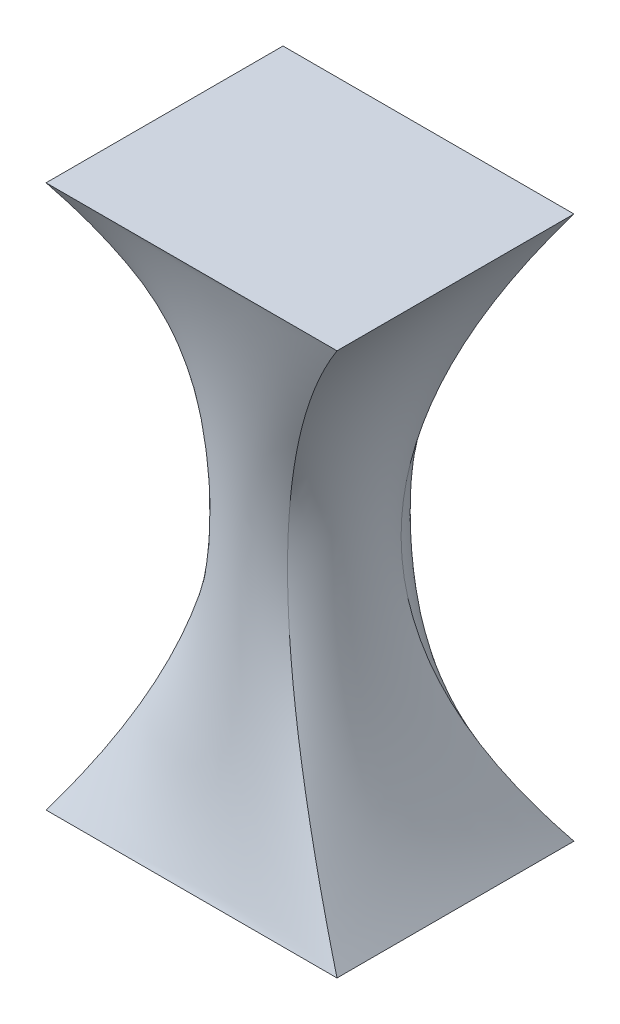
ISO-10303-21;
HEADER;
FILE_DESCRIPTION(('STEP AP214'),'2;1');
FILE_NAME('part.step','',(''),(''),'','','');
FILE_SCHEMA(('AUTOMOTIVE_DESIGN { 1 0 10303 214 1 1 1 1 }'));
ENDSEC;
DATA;
#1=APPLICATION_CONTEXT('core data for automotive mechanical design processes');
#2=APPLICATION_PROTOCOL_DEFINITION('international standard','automotive_design',2000,#1);
#3=PRODUCT_CONTEXT('',#1,'mechanical');
#4=PRODUCT('Part','Part','',(#3));
#5=PRODUCT_RELATED_PRODUCT_CATEGORY('part','',(#4));
#6=PRODUCT_DEFINITION_FORMATION('','',#4);
#7=PRODUCT_DEFINITION_CONTEXT('part definition',#1,'design');
#8=PRODUCT_DEFINITION('design','',#6,#7);
#9=PRODUCT_DEFINITION_SHAPE('','',#8);
#10=(LENGTH_UNIT() NAMED_UNIT(*) SI_UNIT(.MILLI.,.METRE.));
#11=(NAMED_UNIT(*) PLANE_ANGLE_UNIT() SI_UNIT($,.RADIAN.));
#12=(NAMED_UNIT(*) SI_UNIT($,.STERADIAN.) SOLID_ANGLE_UNIT());
#13=UNCERTAINTY_MEASURE_WITH_UNIT(LENGTH_MEASURE(1.E-05),#10,'distance_accuracy_value','');
#14=(GEOMETRIC_REPRESENTATION_CONTEXT(3) GLOBAL_UNCERTAINTY_ASSIGNED_CONTEXT((#13)) GLOBAL_UNIT_ASSIGNED_CONTEXT((#10,
#11,#12)) REPRESENTATION_CONTEXT('',''));
#15=CARTESIAN_POINT('',(0.,0.,0.));
#16=DIRECTION('',(0.,0.,1.));
#17=DIRECTION('',(1.,0.,0.));
#18=AXIS2_PLACEMENT_3D('',#15,#16,#17);
#19=CARTESIAN_POINT('',(0.,0.,0.));
#20=DIRECTION('',(0.,-1.,0.));
#21=DIRECTION('',(0.,0.,-1.));
#22=AXIS2_PLACEMENT_3D('',#19,#20,#21);
#23=PLANE('',#22);
#24=DIRECTION('',(0.,0.,-1.));
#25=VECTOR('',#24,1.);
#26=CARTESIAN_POINT('',(26.7804613137385,0.,21.809610025805));
#27=LINE('',#26,#25);
#28=CARTESIAN_POINT('',(26.7804613137385,0.,21.809610025805));
#29=VERTEX_POINT('',#28);
#30=CARTESIAN_POINT('',(26.7804613137385,0.,-21.809610025805));
#31=VERTEX_POINT('',#30);
#32=EDGE_CURVE('E212',#29,#31,#27,.T.);
#33=ORIENTED_EDGE('',*,*,#32,.F.);
#34=DIRECTION('',(1.,0.,0.));
#35=VECTOR('',#34,1.);
#36=CARTESIAN_POINT('',(-26.7804613137385,0.,21.809610025805));
#37=LINE('',#36,#35);
#38=CARTESIAN_POINT('',(-26.7804613137385,0.,21.809610025805));
#39=VERTEX_POINT('',#38);
#40=EDGE_CURVE('E12',#39,#29,#37,.T.);
#41=ORIENTED_EDGE('',*,*,#40,.F.);
#42=DIRECTION('',(0.,0.,1.));
#43=VECTOR('',#42,1.);
#44=CARTESIAN_POINT('',(-26.7804613137385,0.,21.809610025805));
#45=LINE('',#44,#43);
#46=CARTESIAN_POINT('',(-26.7804613137385,0.,-21.809610025805));
#47=VERTEX_POINT('',#46);
#48=EDGE_CURVE('E98',#47,#39,#45,.T.);
#49=ORIENTED_EDGE('',*,*,#48,.F.);
#50=DIRECTION('',(-1.,0.,0.));
#51=VECTOR('',#50,1.);
#52=CARTESIAN_POINT('',(-26.7804613137385,0.,-21.809610025805));
#53=LINE('',#52,#51);
#54=EDGE_CURVE('E232',#31,#47,#53,.T.);
#55=ORIENTED_EDGE('',*,*,#54,.F.);
#56=EDGE_LOOP('',(#33,#41,#49,#55));
#57=FACE_BOUND('',#56,.T.);
#58=ADVANCED_FACE('F87',(#57),#23,.T.);
#59=CARTESIAN_POINT('',(0.,100.,0.));
#60=DIRECTION('',(0.,-1.,0.));
#61=DIRECTION('',(0.,0.,-1.));
#62=AXIS2_PLACEMENT_3D('',#59,#60,#61);
#63=PLANE('',#62);
#64=DIRECTION('',(0.,0.,-1.));
#65=VECTOR('',#64,1.);
#66=CARTESIAN_POINT('',(26.7804613137385,100.,21.809610025805));
#67=LINE('',#66,#65);
#68=CARTESIAN_POINT('',(26.7804613137385,100.,21.809610025805));
#69=VERTEX_POINT('',#68);
#70=CARTESIAN_POINT('',(26.7804613137385,100.,-21.809610025805));
#71=VERTEX_POINT('',#70);
#72=EDGE_CURVE('E200',#69,#71,#67,.T.);
#73=ORIENTED_EDGE('',*,*,#72,.T.);
#74=DIRECTION('',(-1.,0.,0.));
#75=VECTOR('',#74,1.);
#76=CARTESIAN_POINT('',(-26.7804613137385,100.,-21.809610025805));
#77=LINE('',#76,#75);
#78=CARTESIAN_POINT('',(-26.7804613137385,100.,-21.809610025805));
#79=VERTEX_POINT('',#78);
#80=EDGE_CURVE('E157',#71,#79,#77,.T.);
#81=ORIENTED_EDGE('',*,*,#80,.T.);
#82=DIRECTION('',(0.,0.,1.));
#83=VECTOR('',#82,1.);
#84=CARTESIAN_POINT('',(-26.7804613137385,100.,21.809610025805));
#85=LINE('',#84,#83);
#86=CARTESIAN_POINT('',(-26.7804613137385,100.,21.809610025805));
#87=VERTEX_POINT('',#86);
#88=EDGE_CURVE('E137',#79,#87,#85,.T.);
#89=ORIENTED_EDGE('',*,*,#88,.T.);
#90=DIRECTION('',(1.,0.,0.));
#91=VECTOR('',#90,1.);
#92=CARTESIAN_POINT('',(-26.7804613137385,100.,21.809610025805));
#93=LINE('',#92,#91);
#94=EDGE_CURVE('E144',#87,#69,#93,.T.);
#95=ORIENTED_EDGE('',*,*,#94,.T.);
#96=EDGE_LOOP('',(#73,#81,#89,#95));
#97=FACE_BOUND('',#96,.T.);
#98=ADVANCED_FACE('F156',(#97),#63,.F.);
#99=CARTESIAN_POINT('',(-26.7804613137385,100.,21.809610025805));
#100=CARTESIAN_POINT('',(-17.079497013062,83.3333333333333,10.2966956184417));
#101=CARTESIAN_POINT('',(-7.37853271238553,50.,-1.21621878892166));
#102=CARTESIAN_POINT('',(-17.079497013062,16.6666666666667,10.2966956184417));
#103=CARTESIAN_POINT('',(-26.7804613137385,0.,21.809610025805));
#104=CARTESIAN_POINT('',(-26.7804613137385,100.,7.26987000860168));
#105=CARTESIAN_POINT('',(-15.9002436816864,83.3333333333333,1.9842028533754));
#106=CARTESIAN_POINT('',(-12.8624661567414,50.,-4.49827068692206));
#107=CARTESIAN_POINT('',(-15.9002436816864,16.6666666666667,1.9842028533754));
#108=CARTESIAN_POINT('',(-26.7804613137385,0.,7.26987000860168));
#109=CARTESIAN_POINT('',(-26.7804613137385,100.,-7.26987000860168));
#110=CARTESIAN_POINT('',(-14.7209903503107,83.3333333333333,-6.32828991169089));
#111=CARTESIAN_POINT('',(-9.60649783463142,50.,-9.22122239361184));
#112=CARTESIAN_POINT('',(-14.7209903503107,16.6666666666667,-6.32828991169089));
#113=CARTESIAN_POINT('',(-26.7804613137385,0.,-7.26987000860168));
#114=CARTESIAN_POINT('',(-26.7804613137385,100.,-21.809610025805));
#115=CARTESIAN_POINT('',(-13.5417370189351,83.3333333333333,-14.6407826767572));
#116=CARTESIAN_POINT('',(-0.303012724131704,50.,-7.47195532770933));
#117=CARTESIAN_POINT('',(-13.5417370189351,16.6666666666667,-14.6407826767572));
#118=CARTESIAN_POINT('',(-26.7804613137385,0.,-21.809610025805));
#119=B_SPLINE_SURFACE_WITH_KNOTS('',3,3,((#99,#100,#101,#102,#103),(#104,#105,#106,#107,#108),
(#109,#110,#111,#112,#113),(#114,#115,#116,#117,#118)),.UNSPECIFIED.,.F.,.F.,.F.,(4,4),(4,1,4),
(0.,1.),(0.,0.5,1.),.UNSPECIFIED.);
#120=CARTESIAN_POINT('',(-26.7804613137385,100.,-21.809610025805));
#121=CARTESIAN_POINT('',(-13.5417370189351,83.3333333333333,-14.6407826767572));
#122=CARTESIAN_POINT('',(-0.303012724131704,50.,-7.47195532770933));
#123=CARTESIAN_POINT('',(-13.5417370189351,16.6666666666667,-14.6407826767572));
#124=CARTESIAN_POINT('',(-26.7804613137385,0.,-21.809610025805));
#125=B_SPLINE_CURVE_WITH_KNOTS('',3,(#120,#121,#122,#123,#124),.UNSPECIFIED.,.F.,.F.,(4,1,4),
(0.,0.5,1.),.UNSPECIFIED.);
#126=EDGE_CURVE('E143',#79,#47,#125,.T.);
#127=CARTESIAN_POINT('',(-26.7804613137385,100.,21.809610025805));
#128=CARTESIAN_POINT('',(-17.079497013062,83.3333333333333,10.2966956184417));
#129=CARTESIAN_POINT('',(-7.37853271238553,50.,-1.21621878892166));
#130=CARTESIAN_POINT('',(-17.079497013062,16.6666666666667,10.2966956184417));
#131=CARTESIAN_POINT('',(-26.7804613137385,0.,21.809610025805));
#132=B_SPLINE_CURVE_WITH_KNOTS('',3,(#127,#128,#129,#130,#131),.UNSPECIFIED.,.F.,.F.,(4,1,4),
(0.,0.5,1.),.UNSPECIFIED.);
#133=EDGE_CURVE('E132',#39,#87,#132,.F.);
#134=ORIENTED_EDGE('',*,*,#88,.F.);
#135=ORIENTED_EDGE('',*,*,#126,.T.);
#136=ORIENTED_EDGE('',*,*,#48,.T.);
#137=ORIENTED_EDGE('',*,*,#133,.T.);
#138=EDGE_LOOP('',(#134,#135,#136,#137));
#139=FACE_BOUND('',#138,.T.);
#140=ADVANCED_FACE('F134',(#139),#119,.T.);
#141=CARTESIAN_POINT('',(-26.7804613137385,100.,-21.809610025805));
#142=CARTESIAN_POINT('',(-13.5417370189351,83.3333333333333,-14.6407826767572));
#143=CARTESIAN_POINT('',(-0.303012724131706,50.,-7.47195532770932));
#144=CARTESIAN_POINT('',(-13.5417370189351,16.6666666666667,-14.6407826767572));
#145=CARTESIAN_POINT('',(-26.7804613137385,0.,-21.809610025805));
#146=CARTESIAN_POINT('',(-24.5487562042603,100.,-21.809610025805));
#147=CARTESIAN_POINT('',(-12.2257053993901,83.3333333333333,-14.9491731373812));
#148=CARTESIAN_POINT('',(0.0433291222306049,50.,-8.20437422368112));
#149=CARTESIAN_POINT('',(-12.2257053993901,16.6666666666667,-14.9491731373812));
#150=CARTESIAN_POINT('',(-24.5487562042603,0.,-21.809610025805));
#151=CARTESIAN_POINT('',(-20.0853459853039,100.,-21.8096100258051));
#152=CARTESIAN_POINT('',(-9.59364216030018,83.3333333333333,-15.5659540586292));
#153=CARTESIAN_POINT('',(0.923109845297939,50.0000000000001,-9.26861951399294));
#154=CARTESIAN_POINT('',(-9.59364216030017,16.6666666666667,-15.5659540586293));
#155=CARTESIAN_POINT('',(-20.0853459853039,0.,-21.8096100258051));
#156=CARTESIAN_POINT('',(-13.3902306568693,100.,-21.8096100258051));
#157=CARTESIAN_POINT('',(-5.471435703682,83.3333333333333,-15.972303356156));
#158=CARTESIAN_POINT('',(2.44071504229896,49.9999999999999,-10.149414745533));
#159=CARTESIAN_POINT('',(-5.471435703682,16.6666666666666,-15.972303356156));
#160=CARTESIAN_POINT('',(-13.3902306568692,0.,-21.8096100258051));
#161=CARTESIAN_POINT('',(-6.69511532843463,100.,-21.809610025805));
#162=CARTESIAN_POINT('',(-1.32252430956442,83.3333333333334,-15.9922761387048));
#163=CARTESIAN_POINT('',(4.05159535753651,50.,-10.1709485929607));
#164=CARTESIAN_POINT('',(-1.32252430956441,16.6666666666667,-15.9922761387048));
#165=CARTESIAN_POINT('',(-6.69511532843463,0.,-21.809610025805));
#166=CARTESIAN_POINT('',(0.,100.,-21.809610025805));
#167=CARTESIAN_POINT('',(2.82471917331589,83.3333333333333,-15.5719285772251));
#168=CARTESIAN_POINT('',(5.64996796091515,49.9999999999999,-9.33580370419463));
#169=CARTESIAN_POINT('',(2.82471917331589,16.6666666666666,-15.5719285772251));
#170=CARTESIAN_POINT('',(0.,0.,-21.809610025805));
#171=CARTESIAN_POINT('',(6.69511532843462,100.,-21.809610025805));
#172=CARTESIAN_POINT('',(6.83083486808161,83.3333333333333,-14.7367960085645));
#173=CARTESIAN_POINT('',(6.96290730236437,50.0000000000001,-7.66174934776997));
#174=CARTESIAN_POINT('',(6.8308348680816,16.6666666666667,-14.7367960085646));
#175=CARTESIAN_POINT('',(6.69511532843462,0.,-21.809610025805));
#176=CARTESIAN_POINT('',(13.3902306568692,100.,-21.8096100258051));
#177=CARTESIAN_POINT('',(10.5697284493082,83.3333333333333,-13.5516961138163));
#178=CARTESIAN_POINT('',(7.76328504892058,49.9999999999998,-5.30115620049425));
#179=CARTESIAN_POINT('',(10.5697284493081,16.6666666666666,-13.5516961138162));
#180=CARTESIAN_POINT('',(13.3902306568692,0.,-21.8096100258051));
#181=CARTESIAN_POINT('',(20.0853459853039,100.,-21.8096100258051));
#182=CARTESIAN_POINT('',(14.0518141053136,83.3333333333333,-12.0766830345507));
#183=CARTESIAN_POINT('',(7.96569410199353,50.0000000000001,-2.31649269218328));
#184=CARTESIAN_POINT('',(14.0518141053137,16.6666666666667,-12.0766830345507));
#185=CARTESIAN_POINT('',(20.0853459853039,0.,-21.8096100258051));
#186=CARTESIAN_POINT('',(24.5487562042603,100.,-21.809610025805));
#187=CARTESIAN_POINT('',(16.0702693771459,83.3333333333333,-10.8900247571447));
#188=CARTESIAN_POINT('',(7.70511563301896,50.,-0.029137975303465));
#189=CARTESIAN_POINT('',(16.0702693771459,16.6666666666667,-10.8900247571447));
#190=CARTESIAN_POINT('',(24.5487562042603,0.,-21.809610025805));
#191=CARTESIAN_POINT('',(26.7804613137385,100.,-21.809610025805));
#192=CARTESIAN_POINT('',(17.079497013062,83.3333333333333,-10.2966956184417));
#193=CARTESIAN_POINT('',(7.37853271238553,50.,1.21621878892167));
#194=CARTESIAN_POINT('',(17.079497013062,16.6666666666667,-10.2966956184417));
#195=CARTESIAN_POINT('',(26.7804613137385,0.,-21.809610025805));
#196=B_SPLINE_SURFACE_WITH_KNOTS('',3,3,((#141,#142,#143,#144,#145),(#146,#147,#148,#149,#150),
(#151,#152,#153,#154,#155),(#156,#157,#158,#159,#160),(#161,#162,#163,#164,#165),(#166,#167,
#168,#169,#170),(#171,#172,#173,#174,#175),(#176,#177,#178,#179,#180),(#181,#182,#183,#184,
#185),(#186,#187,#188,#189,#190),(#191,#192,#193,#194,#195)),.UNSPECIFIED.,.F.,.F.,.F.,(4,1,1,1,
1,1,1,1,4),(4,1,4),(0.,0.125,0.25,0.375,0.5,0.625,0.75,0.875,1.),(0.,0.5,1.),.UNSPECIFIED.);
#197=CARTESIAN_POINT('',(26.7804613137385,100.,-21.809610025805));
#198=CARTESIAN_POINT('',(17.079497013062,83.3333333333333,-10.2966956184417));
#199=CARTESIAN_POINT('',(7.37853271238553,50.,1.21621878892167));
#200=CARTESIAN_POINT('',(17.079497013062,16.6666666666667,-10.2966956184417));
#201=CARTESIAN_POINT('',(26.7804613137385,0.,-21.809610025805));
#202=B_SPLINE_CURVE_WITH_KNOTS('',3,(#197,#198,#199,#200,#201),.UNSPECIFIED.,.F.,.F.,(4,1,4),
(0.,0.5,1.),.UNSPECIFIED.);
#203=EDGE_CURVE('E242',#71,#31,#202,.T.);
#204=ORIENTED_EDGE('',*,*,#80,.F.);
#205=ORIENTED_EDGE('',*,*,#203,.T.);
#206=ORIENTED_EDGE('',*,*,#54,.T.);
#207=ORIENTED_EDGE('',*,*,#126,.F.);
#208=EDGE_LOOP('',(#204,#205,#206,#207));
#209=FACE_BOUND('',#208,.T.);
#210=ADVANCED_FACE('F286',(#209),#196,.T.);
#211=CARTESIAN_POINT('',(26.7804613137385,100.,21.809610025805));
#212=CARTESIAN_POINT('',(13.5417370189351,83.3333333333333,14.6407826767572));
#213=CARTESIAN_POINT('',(0.3030127241317,50.,7.47195532770931));
#214=CARTESIAN_POINT('',(13.5417370189351,16.6666666666667,14.6407826767572));
#215=CARTESIAN_POINT('',(26.7804613137385,0.,21.809610025805));
#216=CARTESIAN_POINT('',(24.5487562042603,100.,21.809610025805));
#217=CARTESIAN_POINT('',(12.2257053993901,83.3333333333333,14.9491731373812));
#218=CARTESIAN_POINT('',(-0.0433291222306153,50.,8.20437422368113));
#219=CARTESIAN_POINT('',(12.2257053993901,16.6666666666667,14.9491731373812));
#220=CARTESIAN_POINT('',(24.5487562042603,0.,21.809610025805));
#221=CARTESIAN_POINT('',(20.0853459853039,100.,21.8096100258051));
#222=CARTESIAN_POINT('',(9.59364216030018,83.3333333333333,15.5659540586292));
#223=CARTESIAN_POINT('',(-0.923109845297938,50.0000000000001,9.2686195139929));
#224=CARTESIAN_POINT('',(9.59364216030017,16.6666666666667,15.5659540586292));
#225=CARTESIAN_POINT('',(20.0853459853039,0.,21.8096100258051));
#226=CARTESIAN_POINT('',(13.3902306568692,100.,21.8096100258051));
#227=CARTESIAN_POINT('',(5.47143570368199,83.3333333333333,15.972303356156));
#228=CARTESIAN_POINT('',(-2.44071504229896,49.9999999999999,10.149414745533));
#229=CARTESIAN_POINT('',(5.471435703682,16.6666666666667,15.972303356156));
#230=CARTESIAN_POINT('',(13.3902306568692,0.,21.8096100258051));
#231=CARTESIAN_POINT('',(6.69511532843462,100.,21.809610025805));
#232=CARTESIAN_POINT('',(1.32252430956443,83.3333333333334,15.9922761387048));
#233=CARTESIAN_POINT('',(-4.05159535753651,50.,10.1709485929607));
#234=CARTESIAN_POINT('',(1.32252430956441,16.6666666666667,15.9922761387048));
#235=CARTESIAN_POINT('',(6.69511532843463,0.,21.809610025805));
#236=CARTESIAN_POINT('',(0.,100.,21.809610025805));
#237=CARTESIAN_POINT('',(-2.8247191733159,83.3333333333333,15.5719285772251));
#238=CARTESIAN_POINT('',(-5.64996796091514,49.9999999999999,9.33580370419466));
#239=CARTESIAN_POINT('',(-2.82471917331588,16.6666666666666,15.5719285772251));
#240=CARTESIAN_POINT('',(0.,0.,21.809610025805));
#241=CARTESIAN_POINT('',(-6.69511532843463,100.,21.809610025805));
#242=CARTESIAN_POINT('',(-6.83083486808161,83.3333333333333,14.7367960085645));
#243=CARTESIAN_POINT('',(-6.96290730236437,50.0000000000001,7.66174934776994));
#244=CARTESIAN_POINT('',(-6.83083486808161,16.6666666666667,14.7367960085645));
#245=CARTESIAN_POINT('',(-6.69511532843462,0.,21.809610025805));
#246=CARTESIAN_POINT('',(-13.3902306568692,100.,21.8096100258051));
#247=CARTESIAN_POINT('',(-10.5697284493082,83.3333333333333,13.5516961138163));
#248=CARTESIAN_POINT('',(-7.76328504892056,49.9999999999998,5.3011562004943));
#249=CARTESIAN_POINT('',(-10.5697284493081,16.6666666666666,13.5516961138163));
#250=CARTESIAN_POINT('',(-13.3902306568692,0.,21.8096100258051));
#251=CARTESIAN_POINT('',(-20.0853459853039,100.,21.8096100258051));
#252=CARTESIAN_POINT('',(-14.0518141053137,83.3333333333333,12.0766830345506));
#253=CARTESIAN_POINT('',(-7.96569410199351,50.0000000000001,2.31649269218326));
#254=CARTESIAN_POINT('',(-14.0518141053137,16.6666666666667,12.0766830345506));
#255=CARTESIAN_POINT('',(-20.0853459853039,0.,21.8096100258051));
#256=CARTESIAN_POINT('',(-24.5487562042603,100.,21.809610025805));
#257=CARTESIAN_POINT('',(-16.0702693771459,83.3333333333333,10.8900247571447));
#258=CARTESIAN_POINT('',(-7.70511563301895,50.,0.0291379753034945));
#259=CARTESIAN_POINT('',(-16.0702693771459,16.6666666666667,10.8900247571447));
#260=CARTESIAN_POINT('',(-24.5487562042603,0.,21.809610025805));
#261=CARTESIAN_POINT('',(-26.7804613137385,100.,21.809610025805));
#262=CARTESIAN_POINT('',(-17.079497013062,83.3333333333333,10.2966956184417));
#263=CARTESIAN_POINT('',(-7.37853271238554,50.,-1.21621878892165));
#264=CARTESIAN_POINT('',(-17.079497013062,16.6666666666667,10.2966956184417));
#265=CARTESIAN_POINT('',(-26.7804613137385,0.,21.809610025805));
#266=B_SPLINE_SURFACE_WITH_KNOTS('',3,3,((#211,#212,#213,#214,#215),(#216,#217,#218,#219,#220),
(#221,#222,#223,#224,#225),(#226,#227,#228,#229,#230),(#231,#232,#233,#234,#235),(#236,#237,
#238,#239,#240),(#241,#242,#243,#244,#245),(#246,#247,#248,#249,#250),(#251,#252,#253,#254,
#255),(#256,#257,#258,#259,#260),(#261,#262,#263,#264,#265)),.UNSPECIFIED.,.F.,.F.,.F.,(4,1,1,1,
1,1,1,1,4),(4,1,4),(0.,0.125,0.25,0.375,0.5,0.625,0.75,0.875,1.),(0.,0.5,1.),.UNSPECIFIED.);
#267=CARTESIAN_POINT('',(26.7804613137385,100.,21.809610025805));
#268=CARTESIAN_POINT('',(13.5417370189351,83.3333333333333,14.6407826767572));
#269=CARTESIAN_POINT('',(0.303012724131696,50.,7.47195532770933));
#270=CARTESIAN_POINT('',(13.5417370189351,16.6666666666667,14.6407826767572));
#271=CARTESIAN_POINT('',(26.7804613137385,0.,21.809610025805));
#272=B_SPLINE_CURVE_WITH_KNOTS('',3,(#267,#268,#269,#270,#271),.UNSPECIFIED.,.F.,.F.,(4,1,4),
(0.,0.5,1.),.UNSPECIFIED.);
#273=EDGE_CURVE('E106',#69,#29,#272,.T.);
#274=ORIENTED_EDGE('',*,*,#94,.F.);
#275=ORIENTED_EDGE('',*,*,#133,.F.);
#276=ORIENTED_EDGE('',*,*,#40,.T.);
#277=ORIENTED_EDGE('',*,*,#273,.F.);
#278=EDGE_LOOP('',(#274,#275,#276,#277));
#279=FACE_BOUND('',#278,.T.);
#280=ADVANCED_FACE('F147',(#279),#266,.T.);
#281=CARTESIAN_POINT('',(26.7804613137385,100.,-21.809610025805));
#282=CARTESIAN_POINT('',(17.079497013062,83.3333333333333,-10.2966956184417));
#283=CARTESIAN_POINT('',(7.37853271238553,50.,1.21621878892167));
#284=CARTESIAN_POINT('',(17.079497013062,16.6666666666667,-10.2966956184417));
#285=CARTESIAN_POINT('',(26.7804613137385,0.,-21.809610025805));
#286=CARTESIAN_POINT('',(26.7804613137385,100.,-7.26987000860168));
#287=CARTESIAN_POINT('',(15.9002436816864,83.3333333333333,-1.9842028533754));
#288=CARTESIAN_POINT('',(12.8624661567413,50.,4.49827068692207));
#289=CARTESIAN_POINT('',(15.9002436816864,16.6666666666667,-1.9842028533754));
#290=CARTESIAN_POINT('',(26.7804613137385,0.,-7.26987000860168));
#291=CARTESIAN_POINT('',(26.7804613137385,100.,7.26987000860168));
#292=CARTESIAN_POINT('',(14.7209903503107,83.3333333333333,6.3282899116909));
#293=CARTESIAN_POINT('',(9.60649783463142,50.,9.22122239361184));
#294=CARTESIAN_POINT('',(14.7209903503107,16.6666666666667,6.3282899116909));
#295=CARTESIAN_POINT('',(26.7804613137385,0.,7.26987000860168));
#296=CARTESIAN_POINT('',(26.7804613137385,100.,21.809610025805));
#297=CARTESIAN_POINT('',(13.5417370189351,83.3333333333333,14.6407826767572));
#298=CARTESIAN_POINT('',(0.303012724131696,50.,7.47195532770933));
#299=CARTESIAN_POINT('',(13.5417370189351,16.6666666666667,14.6407826767572));
#300=CARTESIAN_POINT('',(26.7804613137385,0.,21.809610025805));
#301=B_SPLINE_SURFACE_WITH_KNOTS('',3,3,((#281,#282,#283,#284,#285),(#286,#287,#288,#289,#290),
(#291,#292,#293,#294,#295),(#296,#297,#298,#299,#300)),.UNSPECIFIED.,.F.,.F.,.F.,(4,4),(4,1,4),
(0.,1.),(0.,0.5,1.),.UNSPECIFIED.);
#302=ORIENTED_EDGE('',*,*,#72,.F.);
#303=ORIENTED_EDGE('',*,*,#273,.T.);
#304=ORIENTED_EDGE('',*,*,#32,.T.);
#305=ORIENTED_EDGE('',*,*,#203,.F.);
#306=EDGE_LOOP('',(#302,#303,#304,#305));
#307=FACE_BOUND('',#306,.T.);
#308=ADVANCED_FACE('F319',(#307),#301,.T.);
#309=CLOSED_SHELL('',(#58,#98,#140,#210,#280,#308));
#310=MANIFOLD_SOLID_BREP('B2',#309);
#311=ADVANCED_BREP_SHAPE_REPRESENTATION('',(#18,#310),#14);
#312=SHAPE_DEFINITION_REPRESENTATION(#9,#311);
ENDSEC;
END-ISO-10303-21;
